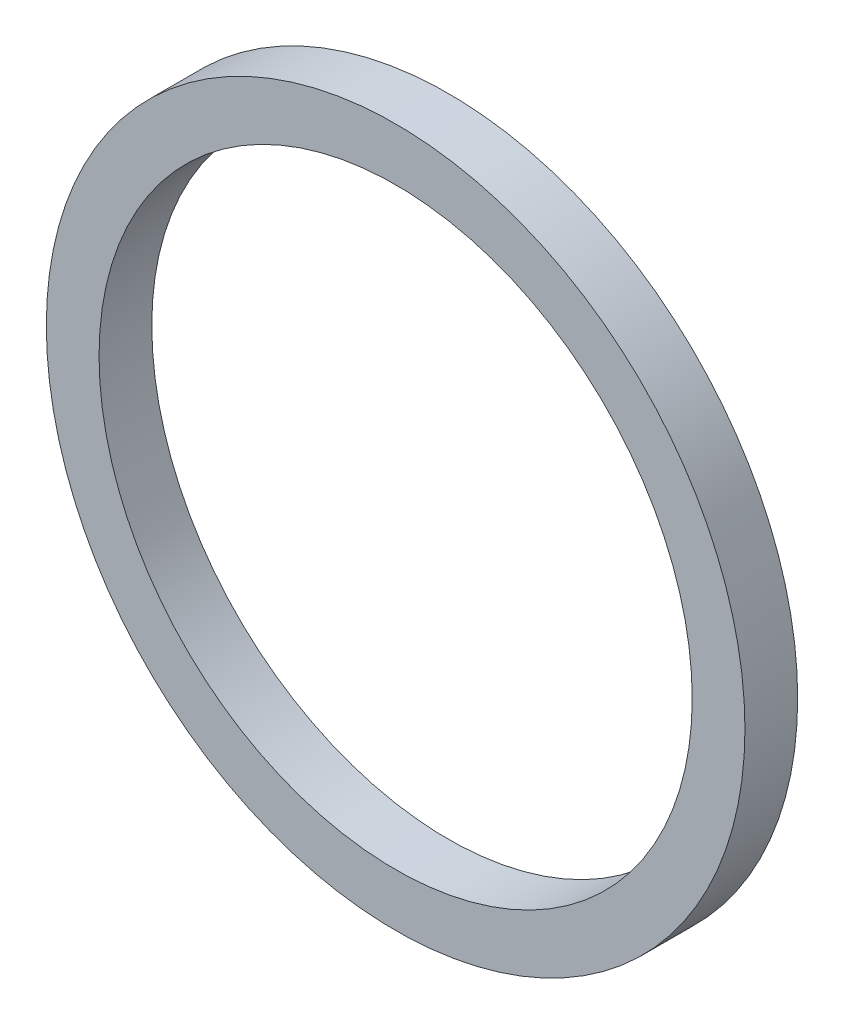
ISO-10303-21;
HEADER;
FILE_DESCRIPTION(('STEP AP214'),'2;1');
FILE_NAME('part.step','',(''),(''),'','','');
FILE_SCHEMA(('AUTOMOTIVE_DESIGN { 1 0 10303 214 1 1 1 1 }'));
ENDSEC;
DATA;
#1=APPLICATION_CONTEXT('core data for automotive mechanical design processes');
#2=APPLICATION_PROTOCOL_DEFINITION('international standard','automotive_design',2000,#1);
#3=PRODUCT_CONTEXT('',#1,'mechanical');
#4=PRODUCT('Part','Part','',(#3));
#5=PRODUCT_RELATED_PRODUCT_CATEGORY('part','',(#4));
#6=PRODUCT_DEFINITION_FORMATION('','',#4);
#7=PRODUCT_DEFINITION_CONTEXT('part definition',#1,'design');
#8=PRODUCT_DEFINITION('design','',#6,#7);
#9=PRODUCT_DEFINITION_SHAPE('','',#8);
#10=(LENGTH_UNIT() NAMED_UNIT(*) SI_UNIT(.MILLI.,.METRE.));
#11=(NAMED_UNIT(*) PLANE_ANGLE_UNIT() SI_UNIT($,.RADIAN.));
#12=(NAMED_UNIT(*) SI_UNIT($,.STERADIAN.) SOLID_ANGLE_UNIT());
#13=UNCERTAINTY_MEASURE_WITH_UNIT(LENGTH_MEASURE(1.E-05),#10,'distance_accuracy_value','');
#14=(GEOMETRIC_REPRESENTATION_CONTEXT(3) GLOBAL_UNCERTAINTY_ASSIGNED_CONTEXT((#13)) GLOBAL_UNIT_ASSIGNED_CONTEXT((#10,
#11,#12)) REPRESENTATION_CONTEXT('',''));
#15=CARTESIAN_POINT('',(0.,0.,0.));
#16=DIRECTION('',(0.,0.,1.));
#17=DIRECTION('',(1.,0.,0.));
#18=AXIS2_PLACEMENT_3D('',#15,#16,#17);
#19=CARTESIAN_POINT('',(0.,0.,4.));
#20=DIRECTION('',(0.,0.,1.));
#21=DIRECTION('',(1.,0.,0.));
#22=AXIS2_PLACEMENT_3D('',#19,#20,#21);
#23=PLANE('',#22);
#24=CARTESIAN_POINT('',(0.,0.,4.));
#25=DIRECTION('',(0.,0.,1.));
#26=DIRECTION('',(1.,0.,0.));
#27=AXIS2_PLACEMENT_3D('',#24,#25,#26);
#28=CIRCLE('',#27,53.);
#29=CARTESIAN_POINT('',(53.,0.,4.));
#30=VERTEX_POINT('',#29);
#31=EDGE_CURVE('E11',#30,#30,#28,.T.);
#32=ORIENTED_EDGE('',*,*,#31,.T.);
#33=EDGE_LOOP('',(#32));
#34=FACE_BOUND('',#33,.T.);
#35=CARTESIAN_POINT('',(0.,0.,4.));
#36=DIRECTION('',(0.,0.,1.));
#37=DIRECTION('',(1.,0.,0.));
#38=AXIS2_PLACEMENT_3D('',#35,#36,#37);
#39=CIRCLE('',#38,45.);
#40=CARTESIAN_POINT('',(45.,0.,4.));
#41=VERTEX_POINT('',#40);
#42=EDGE_CURVE('E49',#41,#41,#39,.T.);
#43=ORIENTED_EDGE('',*,*,#42,.F.);
#44=EDGE_LOOP('',(#43));
#45=FACE_BOUND('',#44,.T.);
#46=ADVANCED_FACE('F38',(#34,#45),#23,.T.);
#47=CARTESIAN_POINT('',(0.,0.,-4.));
#48=DIRECTION('',(0.,0.,1.));
#49=DIRECTION('',(1.,0.,0.));
#50=AXIS2_PLACEMENT_3D('',#47,#48,#49);
#51=PLANE('',#50);
#52=CARTESIAN_POINT('',(0.,0.,-4.));
#53=DIRECTION('',(0.,0.,1.));
#54=DIRECTION('',(1.,0.,0.));
#55=AXIS2_PLACEMENT_3D('',#52,#53,#54);
#56=CIRCLE('',#55,53.);
#57=CARTESIAN_POINT('',(53.,0.,-4.));
#58=VERTEX_POINT('',#57);
#59=EDGE_CURVE('E42',#58,#58,#56,.T.);
#60=ORIENTED_EDGE('',*,*,#59,.F.);
#61=EDGE_LOOP('',(#60));
#62=FACE_BOUND('',#61,.T.);
#63=CARTESIAN_POINT('',(0.,0.,-4.));
#64=DIRECTION('',(0.,0.,1.));
#65=DIRECTION('',(1.,0.,0.));
#66=AXIS2_PLACEMENT_3D('',#63,#64,#65);
#67=CIRCLE('',#66,45.);
#68=CARTESIAN_POINT('',(45.,0.,-4.));
#69=VERTEX_POINT('',#68);
#70=EDGE_CURVE('E51',#69,#69,#67,.T.);
#71=ORIENTED_EDGE('',*,*,#70,.T.);
#72=EDGE_LOOP('',(#71));
#73=FACE_BOUND('',#72,.T.);
#74=ADVANCED_FACE('F61',(#62,#73),#51,.F.);
#75=CARTESIAN_POINT('',(0.,0.,4.));
#76=DIRECTION('',(0.,0.,-1.));
#77=DIRECTION('',(-1.,0.,0.));
#78=AXIS2_PLACEMENT_3D('',#75,#76,#77);
#79=CYLINDRICAL_SURFACE('',#78,53.);
#80=ORIENTED_EDGE('',*,*,#31,.F.);
#81=EDGE_LOOP('',(#80));
#82=FACE_BOUND('',#81,.T.);
#83=ORIENTED_EDGE('',*,*,#59,.T.);
#84=EDGE_LOOP('',(#83));
#85=FACE_BOUND('',#84,.T.);
#86=ADVANCED_FACE('F40',(#82,#85),#79,.T.);
#87=CARTESIAN_POINT('',(0.,0.,4.));
#88=DIRECTION('',(0.,0.,-1.));
#89=DIRECTION('',(-1.,0.,0.));
#90=AXIS2_PLACEMENT_3D('',#87,#88,#89);
#91=CYLINDRICAL_SURFACE('',#90,45.);
#92=ORIENTED_EDGE('',*,*,#42,.T.);
#93=EDGE_LOOP('',(#92));
#94=FACE_BOUND('',#93,.T.);
#95=ORIENTED_EDGE('',*,*,#70,.F.);
#96=EDGE_LOOP('',(#95));
#97=FACE_BOUND('',#96,.T.);
#98=ADVANCED_FACE('F57',(#94,#97),#91,.F.);
#99=CLOSED_SHELL('',(#46,#74,#86,#98));
#100=MANIFOLD_SOLID_BREP('B2',#99);
#101=ADVANCED_BREP_SHAPE_REPRESENTATION('',(#18,#100),#14);
#102=SHAPE_DEFINITION_REPRESENTATION(#9,#101);
ENDSEC;
END-ISO-10303-21;
